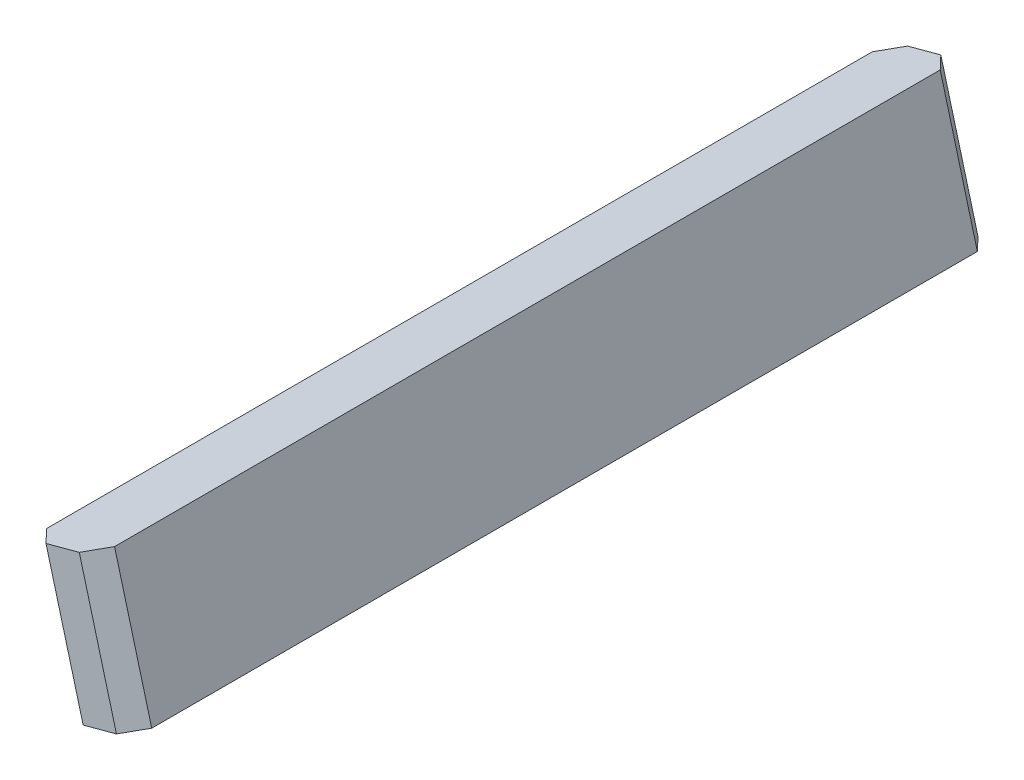
ISO-10303-21;
HEADER;
FILE_DESCRIPTION(('STEP AP214'),'2;1');
FILE_NAME('part.step','',(''),(''),'','','');
FILE_SCHEMA(('AUTOMOTIVE_DESIGN { 1 0 10303 214 1 1 1 1 }'));
ENDSEC;
DATA;
#1=APPLICATION_CONTEXT('core data for automotive mechanical design processes');
#2=APPLICATION_PROTOCOL_DEFINITION('international standard','automotive_design',2000,#1);
#3=PRODUCT_CONTEXT('',#1,'mechanical');
#4=PRODUCT('Part','Part','',(#3));
#5=PRODUCT_RELATED_PRODUCT_CATEGORY('part','',(#4));
#6=PRODUCT_DEFINITION_FORMATION('','',#4);
#7=PRODUCT_DEFINITION_CONTEXT('part definition',#1,'design');
#8=PRODUCT_DEFINITION('design','',#6,#7);
#9=PRODUCT_DEFINITION_SHAPE('','',#8);
#10=(LENGTH_UNIT() NAMED_UNIT(*) SI_UNIT(.MILLI.,.METRE.));
#11=(NAMED_UNIT(*) PLANE_ANGLE_UNIT() SI_UNIT($,.RADIAN.));
#12=(NAMED_UNIT(*) SI_UNIT($,.STERADIAN.) SOLID_ANGLE_UNIT());
#13=UNCERTAINTY_MEASURE_WITH_UNIT(LENGTH_MEASURE(1.E-05),#10,'distance_accuracy_value','');
#14=(GEOMETRIC_REPRESENTATION_CONTEXT(3) GLOBAL_UNCERTAINTY_ASSIGNED_CONTEXT((#13)) GLOBAL_UNIT_ASSIGNED_CONTEXT((#10,
#11,#12)) REPRESENTATION_CONTEXT('',''));
#15=CARTESIAN_POINT('',(0.,0.,0.));
#16=DIRECTION('',(0.,0.,1.));
#17=DIRECTION('',(1.,0.,0.));
#18=AXIS2_PLACEMENT_3D('',#15,#16,#17);
#19=CARTESIAN_POINT('',(10.3527618041006,0.,60.));
#20=DIRECTION('',(-0.259999805678018,0.965608668689026,0.));
#21=DIRECTION('',(-0.965608668689026,-0.259999805678018,0.));
#22=AXIS2_PLACEMENT_3D('',#19,#20,#21);
#23=PLANE('',#22);
#24=DIRECTION('',(0.,0.,-1.));
#25=VECTOR('',#24,1.);
#26=CARTESIAN_POINT('',(19.9122947688427,2.574,60.));
#27=LINE('',#26,#25);
#28=CARTESIAN_POINT('',(19.9122947688427,2.574,57.5));
#29=VERTEX_POINT('',#28);
#30=CARTESIAN_POINT('',(19.9122947688427,2.574,-57.5));
#31=VERTEX_POINT('',#30);
#32=EDGE_CURVE('E143',#29,#31,#27,.T.);
#33=ORIENTED_EDGE('',*,*,#32,.F.);
#34=DIRECTION('',(-0.68278869275796,-0.183847694405268,0.707106516943341));
#35=VECTOR('',#34,1.);
#36=CARTESIAN_POINT('',(17.4998476124509,1.92442443982827,59.998367539122));
#37=LINE('',#36,#35);
#38=CARTESIAN_POINT('',(17.4982712928977,1.92399999999999,60.));
#39=VERTEX_POINT('',#38);
#40=EDGE_CURVE('E175',#29,#39,#37,.T.);
#41=ORIENTED_EDGE('',*,*,#40,.T.);
#42=DIRECTION('',(0.965608668689026,0.259999805678018,0.));
#43=VECTOR('',#42,1.);
#44=CARTESIAN_POINT('',(10.3527618041006,0.,60.));
#45=LINE('',#44,#43);
#46=CARTESIAN_POINT('',(12.8633462190834,0.676000000000001,60.));
#47=VERTEX_POINT('',#46);
#48=EDGE_CURVE('E200',#47,#39,#45,.T.);
#49=ORIENTED_EDGE('',*,*,#48,.F.);
#50=DIRECTION('',(-0.68278869275796,-0.183847694405268,-0.707106516943341));
#51=VECTOR('',#50,1.);
#52=CARTESIAN_POINT('',(12.8649260027449,0.676425372574136,60.001636048362));
#53=LINE('',#52,#51);
#54=CARTESIAN_POINT('',(10.4493227431384,0.0260000000000003,57.5));
#55=VERTEX_POINT('',#54);
#56=EDGE_CURVE('E73',#47,#55,#53,.T.);
#57=ORIENTED_EDGE('',*,*,#56,.T.);
#58=DIRECTION('',(0.,0.,-1.));
#59=VECTOR('',#58,1.);
#60=CARTESIAN_POINT('',(10.4493227431384,0.0260000000000003,60.));
#61=LINE('',#60,#59);
#62=CARTESIAN_POINT('',(10.4493227431384,0.0260000000000003,-57.5));
#63=VERTEX_POINT('',#62);
#64=EDGE_CURVE('E150',#55,#63,#61,.T.);
#65=ORIENTED_EDGE('',*,*,#64,.T.);
#66=DIRECTION('',(-0.682788692757962,-0.183847694405268,0.707106516943339));
#67=VECTOR('',#66,1.);
#68=CARTESIAN_POINT('',(10.4729340136897,0.032357571088798,-57.5244521964954));
#69=LINE('',#68,#67);
#70=CARTESIAN_POINT('',(12.8633462190834,0.676000000000002,-60.));
#71=VERTEX_POINT('',#70);
#72=EDGE_CURVE('E65',#63,#71,#69,.F.);
#73=ORIENTED_EDGE('',*,*,#72,.T.);
#74=DIRECTION('',(0.965608668689026,0.259999805678018,0.));
#75=VECTOR('',#74,1.);
#76=CARTESIAN_POINT('',(10.3527618041006,0.,-60.));
#77=LINE('',#76,#75);
#78=CARTESIAN_POINT('',(17.4982712928977,1.92399999999999,-60.));
#79=VERTEX_POINT('',#78);
#80=EDGE_CURVE('E191',#71,#79,#77,.T.);
#81=ORIENTED_EDGE('',*,*,#80,.T.);
#82=DIRECTION('',(-0.682788692757963,-0.183847694405268,-0.707106516943338));
#83=VECTOR('',#82,1.);
#84=CARTESIAN_POINT('',(19.9122948410116,2.57400001943221,-57.4999999252607));
#85=LINE('',#84,#83);
#86=EDGE_CURVE('E170',#79,#31,#85,.F.);
#87=ORIENTED_EDGE('',*,*,#86,.T.);
#88=EDGE_LOOP('',(#33,#41,#49,#57,#65,#73,#81,#87));
#89=FACE_BOUND('',#88,.T.);
#90=ADVANCED_FACE('F48',(#89),#23,.F.);
#91=CARTESIAN_POINT('',(19.9122631252516,2.57411809548975,60.));
#92=DIRECTION('',(-0.96592582628907,-0.258819045102515,0.));
#93=DIRECTION('',(0.258819045102515,-0.96592582628907,0.));
#94=AXIS2_PLACEMENT_3D('',#91,#92,#93);
#95=PLANE('',#94);
#96=DIRECTION('',(0.,0.,1.));
#97=VECTOR('',#96,1.);
#98=CARTESIAN_POINT('',(14.7359138667924,21.8925165257814,60.));
#99=LINE('',#98,#97);
#100=CARTESIAN_POINT('',(14.7359138667924,21.8925165257814,-57.5));
#101=VERTEX_POINT('',#100);
#102=CARTESIAN_POINT('',(14.7359138667924,21.8925165257814,57.5));
#103=VERTEX_POINT('',#102);
#104=EDGE_CURVE('E204',#101,#103,#99,.T.);
#105=ORIENTED_EDGE('',*,*,#104,.T.);
#106=DIRECTION('',(0.258819045102515,-0.96592582628907,0.));
#107=VECTOR('',#106,1.);
#108=CARTESIAN_POINT('',(19.9122947688427,2.574,57.5));
#109=LINE('',#108,#107);
#110=EDGE_CURVE('E165',#103,#29,#109,.T.);
#111=ORIENTED_EDGE('',*,*,#110,.T.);
#112=ORIENTED_EDGE('',*,*,#32,.T.);
#113=DIRECTION('',(-0.258819045102515,0.96592582628907,0.));
#114=VECTOR('',#113,1.);
#115=CARTESIAN_POINT('',(19.9122631252516,2.57411809548975,-57.5));
#116=LINE('',#115,#114);
#117=EDGE_CURVE('E161',#31,#101,#116,.T.);
#118=ORIENTED_EDGE('',*,*,#117,.T.);
#119=EDGE_LOOP('',(#105,#111,#112,#118));
#120=FACE_BOUND('',#119,.T.);
#121=ADVANCED_FACE('F214',(#120),#95,.F.);
#122=CARTESIAN_POINT('',(0.0965925826289087,38.662914956073,60.));
#123=DIRECTION('',(0.96592582628907,0.258819045102515,0.));
#124=DIRECTION('',(-0.258819045102515,0.96592582628907,0.));
#125=AXIS2_PLACEMENT_3D('',#122,#123,#124);
#126=PLANE('',#125);
#127=ORIENTED_EDGE('',*,*,#64,.F.);
#128=DIRECTION('',(-0.258819045102515,0.96592582628907,0.));
#129=VECTOR('',#128,1.);
#130=CARTESIAN_POINT('',(5.27294184108809,19.3445165257814,57.5));
#131=LINE('',#130,#129);
#132=CARTESIAN_POINT('',(5.27294184108809,19.3445165257814,57.5));
#133=VERTEX_POINT('',#132);
#134=EDGE_CURVE('E181',#55,#133,#131,.T.);
#135=ORIENTED_EDGE('',*,*,#134,.T.);
#136=DIRECTION('',(0.,0.,1.));
#137=VECTOR('',#136,1.);
#138=CARTESIAN_POINT('',(5.27294184108809,19.3445165257814,-60.));
#139=LINE('',#138,#137);
#140=CARTESIAN_POINT('',(5.27294184108809,19.3445165257814,-57.5));
#141=VERTEX_POINT('',#140);
#142=EDGE_CURVE('E122',#141,#133,#139,.T.);
#143=ORIENTED_EDGE('',*,*,#142,.F.);
#144=DIRECTION('',(0.258819045102515,-0.96592582628907,0.));
#145=VECTOR('',#144,1.);
#146=CARTESIAN_POINT('',(0.0965925826289087,38.662914956073,-57.5));
#147=LINE('',#146,#145);
#148=EDGE_CURVE('E178',#141,#63,#147,.T.);
#149=ORIENTED_EDGE('',*,*,#148,.T.);
#150=EDGE_LOOP('',(#127,#135,#143,#149));
#151=FACE_BOUND('',#150,.T.);
#152=ADVANCED_FACE('F197',(#151),#126,.F.);
#153=CARTESIAN_POINT('',(0.,0.,60.));
#154=DIRECTION('',(0.,0.,1.));
#155=DIRECTION('',(1.,0.,0.));
#156=AXIS2_PLACEMENT_3D('',#153,#154,#155);
#157=PLANE('',#156);
#158=ORIENTED_EDGE('',*,*,#48,.T.);
#159=DIRECTION('',(-0.258819045102515,0.96592582628907,0.));
#160=VECTOR('',#159,1.);
#161=CARTESIAN_POINT('',(12.3210993010697,21.2454689130251,60.));
#162=LINE('',#161,#160);
#163=CARTESIAN_POINT('',(12.3218903908474,21.2425165257814,60.));
#164=VERTEX_POINT('',#163);
#165=EDGE_CURVE('E137',#39,#164,#162,.T.);
#166=ORIENTED_EDGE('',*,*,#165,.T.);
#167=DIRECTION('',(0.965608668689026,0.259999805678017,0.));
#168=VECTOR('',#167,1.);
#169=CARTESIAN_POINT('',(5.17638090205029,19.3185165257814,60.));
#170=LINE('',#169,#168);
#171=CARTESIAN_POINT('',(7.68696531703307,19.9945165257814,60.));
#172=VERTEX_POINT('',#171);
#173=EDGE_CURVE('E120',#172,#164,#170,.T.);
#174=ORIENTED_EDGE('',*,*,#173,.F.);
#175=DIRECTION('',(0.258819045102515,-0.96592582628907,0.));
#176=VECTOR('',#175,1.);
#177=CARTESIAN_POINT('',(12.8641373088611,0.673047612756287,60.));
#178=LINE('',#177,#176);
#179=EDGE_CURVE('E135',#172,#47,#178,.T.);
#180=ORIENTED_EDGE('',*,*,#179,.T.);
#181=EDGE_LOOP('',(#158,#166,#174,#180));
#182=FACE_BOUND('',#181,.T.);
#183=ADVANCED_FACE('F134',(#182),#157,.T.);
#184=CARTESIAN_POINT('',(0.,0.,-60.));
#185=DIRECTION('',(0.,0.,1.));
#186=DIRECTION('',(1.,0.,0.));
#187=AXIS2_PLACEMENT_3D('',#184,#185,#186);
#188=PLANE('',#187);
#189=DIRECTION('',(0.965608668689026,0.259999805678017,0.));
#190=VECTOR('',#189,1.);
#191=CARTESIAN_POINT('',(5.17638090205029,19.3185165257814,-60.));
#192=LINE('',#191,#190);
#193=CARTESIAN_POINT('',(7.68696531703307,19.9945165257814,-60.));
#194=VERTEX_POINT('',#193);
#195=CARTESIAN_POINT('',(12.3218903908474,21.2425165257814,-60.));
#196=VERTEX_POINT('',#195);
#197=EDGE_CURVE('E139',#194,#196,#192,.T.);
#198=ORIENTED_EDGE('',*,*,#197,.T.);
#199=DIRECTION('',(0.258819045102515,-0.96592582628907,0.));
#200=VECTOR('',#199,1.);
#201=CARTESIAN_POINT('',(16.8071093774296,4.50345138478369,-60.));
#202=LINE('',#201,#200);
#203=EDGE_CURVE('E12',#196,#79,#202,.T.);
#204=ORIENTED_EDGE('',*,*,#203,.T.);
#205=ORIENTED_EDGE('',*,*,#80,.F.);
#206=DIRECTION('',(-0.258819045102515,0.96592582628907,0.));
#207=VECTOR('',#206,1.);
#208=CARTESIAN_POINT('',(12.1706654112421,3.26111996829163,-60.));
#209=LINE('',#208,#207);
#210=EDGE_CURVE('E58',#71,#194,#209,.T.);
#211=ORIENTED_EDGE('',*,*,#210,.T.);
#212=EDGE_LOOP('',(#198,#204,#205,#211));
#213=FACE_BOUND('',#212,.T.);
#214=ADVANCED_FACE('F188',(#213),#188,.F.);
#215=CARTESIAN_POINT('',(5.17638090205029,19.3185165257814,-60.));
#216=DIRECTION('',(0.259999805678017,-0.965608668689026,0.));
#217=DIRECTION('',(0.965608668689026,0.259999805678017,0.));
#218=AXIS2_PLACEMENT_3D('',#215,#216,#217);
#219=PLANE('',#218);
#220=ORIENTED_EDGE('',*,*,#173,.T.);
#221=DIRECTION('',(0.68278869275796,0.183847694405267,-0.707106516943341));
#222=VECTOR('',#221,1.);
#223=CARTESIAN_POINT('',(12.3116610390405,21.2397621703492,60.0105936747393));
#224=LINE('',#223,#222);
#225=EDGE_CURVE('E127',#164,#103,#224,.T.);
#226=ORIENTED_EDGE('',*,*,#225,.T.);
#227=ORIENTED_EDGE('',*,*,#104,.F.);
#228=DIRECTION('',(0.682788692757963,0.183847694405268,0.707106516943338));
#229=VECTOR('',#228,1.);
#230=CARTESIAN_POINT('',(14.7241082676012,21.8893377499531,-57.512226060878));
#231=LINE('',#230,#229);
#232=EDGE_CURVE('E128',#101,#196,#231,.F.);
#233=ORIENTED_EDGE('',*,*,#232,.T.);
#234=ORIENTED_EDGE('',*,*,#197,.F.);
#235=DIRECTION('',(0.682788692757962,0.183847694405268,-0.707106516943339));
#236=VECTOR('',#235,1.);
#237=CARTESIAN_POINT('',(5.28474744027928,19.3476953016097,-57.512226060878));
#238=LINE('',#237,#236);
#239=EDGE_CURVE('E147',#194,#141,#238,.F.);
#240=ORIENTED_EDGE('',*,*,#239,.T.);
#241=ORIENTED_EDGE('',*,*,#142,.T.);
#242=DIRECTION('',(0.68278869275796,0.183847694405267,0.707106516943341));
#243=VECTOR('',#242,1.);
#244=CARTESIAN_POINT('',(7.67673942933447,19.991763103095,59.9894099127447));
#245=LINE('',#244,#243);
#246=EDGE_CURVE('E117',#133,#172,#245,.T.);
#247=ORIENTED_EDGE('',*,*,#246,.T.);
#248=EDGE_LOOP('',(#220,#226,#227,#233,#234,#240,#241,#247));
#249=FACE_BOUND('',#248,.T.);
#250=ADVANCED_FACE('F119',(#249),#219,.F.);
#251=CARTESIAN_POINT('',(16.8071093774296,4.50345138478369,60.));
#252=DIRECTION('',(0.683012701892222,0.183012701892215,0.707106781186546));
#253=DIRECTION('',(0.258819045102515,-0.96592582628907,0.));
#254=AXIS2_PLACEMENT_3D('',#251,#252,#253);
#255=PLANE('',#254);
#256=ORIENTED_EDGE('',*,*,#40,.F.);
#257=ORIENTED_EDGE('',*,*,#110,.F.);
#258=ORIENTED_EDGE('',*,*,#225,.F.);
#259=ORIENTED_EDGE('',*,*,#165,.F.);
#260=EDGE_LOOP('',(#256,#257,#258,#259));
#261=FACE_BOUND('',#260,.T.);
#262=ADVANCED_FACE('F218',(#261),#255,.T.);
#263=CARTESIAN_POINT('',(12.1706654112421,3.26111996829163,60.));
#264=DIRECTION('',(-0.683012701892222,-0.183012701892215,0.707106781186545));
#265=DIRECTION('',(-0.258819045102515,0.96592582628907,0.));
#266=AXIS2_PLACEMENT_3D('',#263,#264,#265);
#267=PLANE('',#266);
#268=ORIENTED_EDGE('',*,*,#246,.F.);
#269=ORIENTED_EDGE('',*,*,#134,.F.);
#270=ORIENTED_EDGE('',*,*,#56,.F.);
#271=ORIENTED_EDGE('',*,*,#179,.F.);
#272=EDGE_LOOP('',(#268,#269,#270,#271));
#273=FACE_BOUND('',#272,.T.);
#274=ADVANCED_FACE('F141',(#273),#267,.T.);
#275=CARTESIAN_POINT('',(19.9122631252516,2.57411809548975,-57.5));
#276=DIRECTION('',(-0.68301270189222,-0.183012701892215,0.707106781186548));
#277=DIRECTION('',(-0.258819045102515,0.96592582628907,0.));
#278=AXIS2_PLACEMENT_3D('',#275,#276,#277);
#279=PLANE('',#278);
#280=ORIENTED_EDGE('',*,*,#86,.F.);
#281=ORIENTED_EDGE('',*,*,#203,.F.);
#282=ORIENTED_EDGE('',*,*,#232,.F.);
#283=ORIENTED_EDGE('',*,*,#117,.F.);
#284=EDGE_LOOP('',(#280,#281,#282,#283));
#285=FACE_BOUND('',#284,.T.);
#286=ADVANCED_FACE('F212',(#285),#279,.F.);
#287=CARTESIAN_POINT('',(0.0965925826289087,38.662914956073,-57.5));
#288=DIRECTION('',(0.68301270189222,0.183012701892215,0.707106781186547));
#289=DIRECTION('',(0.258819045102515,-0.96592582628907,0.));
#290=AXIS2_PLACEMENT_3D('',#287,#288,#289);
#291=PLANE('',#290);
#292=ORIENTED_EDGE('',*,*,#239,.F.);
#293=ORIENTED_EDGE('',*,*,#210,.F.);
#294=ORIENTED_EDGE('',*,*,#72,.F.);
#295=ORIENTED_EDGE('',*,*,#148,.F.);
#296=EDGE_LOOP('',(#292,#293,#294,#295));
#297=FACE_BOUND('',#296,.T.);
#298=ADVANCED_FACE('F51',(#297),#291,.F.);
#299=CLOSED_SHELL('',(#90,#121,#152,#183,#214,#250,#262,#274,#286,#298));
#300=MANIFOLD_SOLID_BREP('B2',#299);
#301=ADVANCED_BREP_SHAPE_REPRESENTATION('',(#18,#300),#14);
#302=SHAPE_DEFINITION_REPRESENTATION(#9,#301);
ENDSEC;
END-ISO-10303-21;
